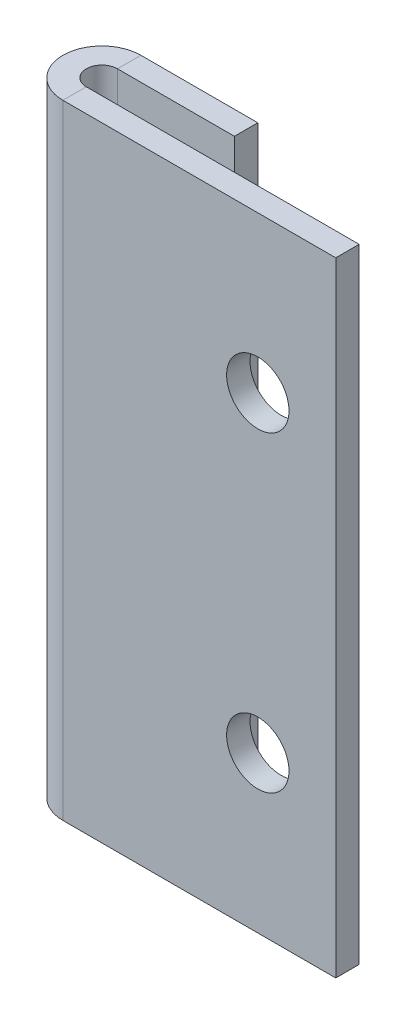
ISO-10303-21;
HEADER;
FILE_DESCRIPTION(('STEP AP214'),'2;1');
FILE_NAME('part.step','',(''),(''),'','','');
FILE_SCHEMA(('AUTOMOTIVE_DESIGN { 1 0 10303 214 1 1 1 1 }'));
ENDSEC;
DATA;
#1=APPLICATION_CONTEXT('core data for automotive mechanical design processes');
#2=APPLICATION_PROTOCOL_DEFINITION('international standard','automotive_design',2000,#1);
#3=PRODUCT_CONTEXT('',#1,'mechanical');
#4=PRODUCT('Part','Part','',(#3));
#5=PRODUCT_RELATED_PRODUCT_CATEGORY('part','',(#4));
#6=PRODUCT_DEFINITION_FORMATION('','',#4);
#7=PRODUCT_DEFINITION_CONTEXT('part definition',#1,'design');
#8=PRODUCT_DEFINITION('design','',#6,#7);
#9=PRODUCT_DEFINITION_SHAPE('','',#8);
#10=(LENGTH_UNIT() NAMED_UNIT(*) SI_UNIT(.MILLI.,.METRE.));
#11=(NAMED_UNIT(*) PLANE_ANGLE_UNIT() SI_UNIT($,.RADIAN.));
#12=(NAMED_UNIT(*) SI_UNIT($,.STERADIAN.) SOLID_ANGLE_UNIT());
#13=UNCERTAINTY_MEASURE_WITH_UNIT(LENGTH_MEASURE(1.E-05),#10,'distance_accuracy_value','');
#14=(GEOMETRIC_REPRESENTATION_CONTEXT(3) GLOBAL_UNCERTAINTY_ASSIGNED_CONTEXT((#13)) GLOBAL_UNIT_ASSIGNED_CONTEXT((#10,
#11,#12)) REPRESENTATION_CONTEXT('',''));
#15=CARTESIAN_POINT('',(0.,0.,0.));
#16=DIRECTION('',(0.,0.,1.));
#17=DIRECTION('',(1.,0.,0.));
#18=AXIS2_PLACEMENT_3D('',#15,#16,#17);
#19=CARTESIAN_POINT('',(-9.99999999999999,20.,-1.5));
#20=DIRECTION('',(0.,1.,0.));
#21=DIRECTION('',(0.,0.,1.));
#22=AXIS2_PLACEMENT_3D('',#19,#20,#21);
#23=PLANE('',#22);
#24=DIRECTION('',(-1.,0.,0.));
#25=VECTOR('',#24,1.);
#26=CARTESIAN_POINT('',(-9.99999999999999,20.,-1.5));
#27=LINE('',#26,#25);
#28=CARTESIAN_POINT('',(10.,20.,-1.5));
#29=VERTEX_POINT('',#28);
#30=CARTESIAN_POINT('',(-7.49999999999999,20.,-1.5));
#31=VERTEX_POINT('',#30);
#32=EDGE_CURVE('E191',#29,#31,#27,.T.);
#33=ORIENTED_EDGE('',*,*,#32,.T.);
#34=DIRECTION('',(0.,0.,1.));
#35=VECTOR('',#34,1.);
#36=CARTESIAN_POINT('',(-7.49999999999999,20.,-1.5));
#37=LINE('',#36,#35);
#38=CARTESIAN_POINT('',(-7.49999999999999,20.,0.));
#39=VERTEX_POINT('',#38);
#40=EDGE_CURVE('E71',#31,#39,#37,.T.);
#41=ORIENTED_EDGE('',*,*,#40,.T.);
#42=DIRECTION('',(-1.,0.,0.));
#43=VECTOR('',#42,1.);
#44=CARTESIAN_POINT('',(-9.99999999999999,20.,0.));
#45=LINE('',#44,#43);
#46=CARTESIAN_POINT('',(10.,20.,0.));
#47=VERTEX_POINT('',#46);
#48=EDGE_CURVE('E112',#47,#39,#45,.T.);
#49=ORIENTED_EDGE('',*,*,#48,.F.);
#50=DIRECTION('',(0.,0.,1.));
#51=VECTOR('',#50,1.);
#52=CARTESIAN_POINT('',(10.,20.,-1.5));
#53=LINE('',#52,#51);
#54=EDGE_CURVE('E41',#29,#47,#53,.T.);
#55=ORIENTED_EDGE('',*,*,#54,.F.);
#56=EDGE_LOOP('',(#33,#41,#49,#55));
#57=FACE_BOUND('',#56,.T.);
#58=ADVANCED_FACE('F37',(#57),#23,.T.);
#59=CARTESIAN_POINT('',(10.,-20.,-1.5));
#60=DIRECTION('',(1.,0.,0.));
#61=DIRECTION('',(0.,0.,-1.));
#62=AXIS2_PLACEMENT_3D('',#59,#60,#61);
#63=PLANE('',#62);
#64=DIRECTION('',(0.,1.,0.));
#65=VECTOR('',#64,1.);
#66=CARTESIAN_POINT('',(10.,-20.,0.));
#67=LINE('',#66,#65);
#68=CARTESIAN_POINT('',(10.,-20.,0.));
#69=VERTEX_POINT('',#68);
#70=EDGE_CURVE('E187',#69,#47,#67,.T.);
#71=ORIENTED_EDGE('',*,*,#70,.F.);
#72=DIRECTION('',(0.,0.,1.));
#73=VECTOR('',#72,1.);
#74=CARTESIAN_POINT('',(10.,-20.,-1.5));
#75=LINE('',#74,#73);
#76=CARTESIAN_POINT('',(10.,-20.,-1.5));
#77=VERTEX_POINT('',#76);
#78=EDGE_CURVE('E11',#77,#69,#75,.T.);
#79=ORIENTED_EDGE('',*,*,#78,.F.);
#80=DIRECTION('',(0.,1.,0.));
#81=VECTOR('',#80,1.);
#82=CARTESIAN_POINT('',(10.,-20.,-1.5));
#83=LINE('',#82,#81);
#84=EDGE_CURVE('E111',#77,#29,#83,.T.);
#85=ORIENTED_EDGE('',*,*,#84,.T.);
#86=ORIENTED_EDGE('',*,*,#54,.T.);
#87=EDGE_LOOP('',(#71,#79,#85,#86));
#88=FACE_BOUND('',#87,.T.);
#89=ADVANCED_FACE('F39',(#88),#63,.T.);
#90=CARTESIAN_POINT('',(-9.99999999999999,-20.,-1.5));
#91=DIRECTION('',(0.,-1.,0.));
#92=DIRECTION('',(0.,0.,-1.));
#93=AXIS2_PLACEMENT_3D('',#90,#91,#92);
#94=PLANE('',#93);
#95=DIRECTION('',(0.,0.,1.));
#96=VECTOR('',#95,1.);
#97=CARTESIAN_POINT('',(-7.49999999999999,-20.,-1.5));
#98=LINE('',#97,#96);
#99=CARTESIAN_POINT('',(-7.49999999999999,-20.,-1.5));
#100=VERTEX_POINT('',#99);
#101=CARTESIAN_POINT('',(-7.49999999999999,-20.,0.));
#102=VERTEX_POINT('',#101);
#103=EDGE_CURVE('E108',#100,#102,#98,.T.);
#104=ORIENTED_EDGE('',*,*,#103,.F.);
#105=DIRECTION('',(1.,0.,0.));
#106=VECTOR('',#105,1.);
#107=CARTESIAN_POINT('',(-9.99999999999999,-20.,-1.5));
#108=LINE('',#107,#106);
#109=EDGE_CURVE('E53',#100,#77,#108,.T.);
#110=ORIENTED_EDGE('',*,*,#109,.T.);
#111=ORIENTED_EDGE('',*,*,#78,.T.);
#112=DIRECTION('',(1.,0.,0.));
#113=VECTOR('',#112,1.);
#114=CARTESIAN_POINT('',(-9.99999999999999,-20.,0.));
#115=LINE('',#114,#113);
#116=EDGE_CURVE('E104',#102,#69,#115,.T.);
#117=ORIENTED_EDGE('',*,*,#116,.F.);
#118=EDGE_LOOP('',(#104,#110,#111,#117));
#119=FACE_BOUND('',#118,.T.);
#120=ADVANCED_FACE('F106',(#119),#94,.T.);
#121=CARTESIAN_POINT('',(0.,0.,-1.5));
#122=DIRECTION('',(0.,0.,-1.));
#123=DIRECTION('',(-1.,0.,0.));
#124=AXIS2_PLACEMENT_3D('',#121,#122,#123);
#125=PLANE('',#124);
#126=DIRECTION('',(0.,1.,0.));
#127=VECTOR('',#126,1.);
#128=CARTESIAN_POINT('',(-7.49999999999999,20.,-1.5));
#129=LINE('',#128,#127);
#130=EDGE_CURVE('E141',#31,#100,#129,.F.);
#131=ORIENTED_EDGE('',*,*,#130,.F.);
#132=ORIENTED_EDGE('',*,*,#32,.F.);
#133=ORIENTED_EDGE('',*,*,#84,.F.);
#134=ORIENTED_EDGE('',*,*,#109,.F.);
#135=EDGE_LOOP('',(#131,#132,#133,#134));
#136=FACE_BOUND('',#135,.T.);
#137=CARTESIAN_POINT('',(5.,-9.99999999999999,-1.5));
#138=DIRECTION('',(0.,0.,1.));
#139=DIRECTION('',(1.,0.,0.));
#140=AXIS2_PLACEMENT_3D('',#137,#138,#139);
#141=CIRCLE('',#140,2.);
#142=CARTESIAN_POINT('',(7.,-9.99999999999999,-1.5));
#143=VERTEX_POINT('',#142);
#144=EDGE_CURVE('E178',#143,#143,#141,.T.);
#145=ORIENTED_EDGE('',*,*,#144,.T.);
#146=EDGE_LOOP('',(#145));
#147=FACE_BOUND('',#146,.T.);
#148=CARTESIAN_POINT('',(5.,9.99999999999999,-1.5));
#149=DIRECTION('',(0.,0.,1.));
#150=DIRECTION('',(1.,0.,0.));
#151=AXIS2_PLACEMENT_3D('',#148,#149,#150);
#152=CIRCLE('',#151,2.);
#153=CARTESIAN_POINT('',(7.,9.99999999999999,-1.5));
#154=VERTEX_POINT('',#153);
#155=EDGE_CURVE('E184',#154,#154,#152,.T.);
#156=ORIENTED_EDGE('',*,*,#155,.T.);
#157=EDGE_LOOP('',(#156));
#158=FACE_BOUND('',#157,.T.);
#159=ADVANCED_FACE('F198',(#136,#147,#158),#125,.T.);
#160=CARTESIAN_POINT('',(0.,0.,0.));
#161=DIRECTION('',(0.,0.,-1.));
#162=DIRECTION('',(-1.,0.,0.));
#163=AXIS2_PLACEMENT_3D('',#160,#161,#162);
#164=PLANE('',#163);
#165=CARTESIAN_POINT('',(5.,-9.99999999999999,0.));
#166=DIRECTION('',(0.,0.,1.));
#167=DIRECTION('',(1.,0.,0.));
#168=AXIS2_PLACEMENT_3D('',#165,#166,#167);
#169=CIRCLE('',#168,2.);
#170=CARTESIAN_POINT('',(7.,-9.99999999999999,0.));
#171=VERTEX_POINT('',#170);
#172=EDGE_CURVE('E176',#171,#171,#169,.T.);
#173=ORIENTED_EDGE('',*,*,#172,.F.);
#174=EDGE_LOOP('',(#173));
#175=FACE_BOUND('',#174,.T.);
#176=CARTESIAN_POINT('',(5.,9.99999999999999,0.));
#177=DIRECTION('',(0.,0.,1.));
#178=DIRECTION('',(1.,0.,0.));
#179=AXIS2_PLACEMENT_3D('',#176,#177,#178);
#180=CIRCLE('',#179,2.);
#181=CARTESIAN_POINT('',(7.,9.99999999999999,0.));
#182=VERTEX_POINT('',#181);
#183=EDGE_CURVE('E181',#182,#182,#180,.T.);
#184=ORIENTED_EDGE('',*,*,#183,.F.);
#185=EDGE_LOOP('',(#184));
#186=FACE_BOUND('',#185,.T.);
#187=ORIENTED_EDGE('',*,*,#48,.T.);
#188=DIRECTION('',(0.,1.,0.));
#189=VECTOR('',#188,1.);
#190=CARTESIAN_POINT('',(-7.49999999999999,20.,0.));
#191=LINE('',#190,#189);
#192=EDGE_CURVE('E115',#39,#102,#191,.F.);
#193=ORIENTED_EDGE('',*,*,#192,.T.);
#194=ORIENTED_EDGE('',*,*,#116,.T.);
#195=ORIENTED_EDGE('',*,*,#70,.T.);
#196=EDGE_LOOP('',(#187,#193,#194,#195));
#197=FACE_BOUND('',#196,.T.);
#198=ADVANCED_FACE('F116',(#175,#186,#197),#164,.F.);
#199=CARTESIAN_POINT('',(5.,9.99999999999999,-1.5));
#200=DIRECTION('',(0.,0.,1.));
#201=DIRECTION('',(1.,0.,0.));
#202=AXIS2_PLACEMENT_3D('',#199,#200,#201);
#203=CYLINDRICAL_SURFACE('',#202,2.);
#204=ORIENTED_EDGE('',*,*,#155,.F.);
#205=EDGE_LOOP('',(#204));
#206=FACE_BOUND('',#205,.T.);
#207=ORIENTED_EDGE('',*,*,#183,.T.);
#208=EDGE_LOOP('',(#207));
#209=FACE_BOUND('',#208,.T.);
#210=ADVANCED_FACE('F239',(#206,#209),#203,.F.);
#211=CARTESIAN_POINT('',(5.,-9.99999999999999,-1.5));
#212=DIRECTION('',(0.,0.,1.));
#213=DIRECTION('',(1.,0.,0.));
#214=AXIS2_PLACEMENT_3D('',#211,#212,#213);
#215=CYLINDRICAL_SURFACE('',#214,2.);
#216=ORIENTED_EDGE('',*,*,#144,.F.);
#217=EDGE_LOOP('',(#216));
#218=FACE_BOUND('',#217,.T.);
#219=ORIENTED_EDGE('',*,*,#172,.T.);
#220=EDGE_LOOP('',(#219));
#221=FACE_BOUND('',#220,.T.);
#222=ADVANCED_FACE('F245',(#218,#221),#215,.F.);
#223=CARTESIAN_POINT('',(-3.74999999999999,20.,-5.));
#224=DIRECTION('',(0.,-1.,0.));
#225=DIRECTION('',(-1.,0.,0.));
#226=AXIS2_PLACEMENT_3D('',#223,#224,#225);
#227=PLANE('',#226);
#228=DIRECTION('',(0.,0.,-1.));
#229=VECTOR('',#228,1.);
#230=CARTESIAN_POINT('',(-7.49999999999999,20.,-5.));
#231=LINE('',#230,#229);
#232=CARTESIAN_POINT('',(-7.49999999999999,20.,-3.5));
#233=VERTEX_POINT('',#232);
#234=CARTESIAN_POINT('',(-7.49999999999999,20.,-5.));
#235=VERTEX_POINT('',#234);
#236=EDGE_CURVE('E170',#233,#235,#231,.T.);
#237=ORIENTED_EDGE('',*,*,#236,.F.);
#238=DIRECTION('',(-1.,0.,0.));
#239=VECTOR('',#238,1.);
#240=CARTESIAN_POINT('',(-3.74999999999999,20.,-3.5));
#241=LINE('',#240,#239);
#242=CARTESIAN_POINT('',(0.,20.,-3.5));
#243=VERTEX_POINT('',#242);
#244=EDGE_CURVE('E161',#243,#233,#241,.T.);
#245=ORIENTED_EDGE('',*,*,#244,.F.);
#246=DIRECTION('',(0.,0.,-1.));
#247=VECTOR('',#246,1.);
#248=CARTESIAN_POINT('',(0.,20.,-5.));
#249=LINE('',#248,#247);
#250=CARTESIAN_POINT('',(0.,20.,-5.));
#251=VERTEX_POINT('',#250);
#252=EDGE_CURVE('E168',#243,#251,#249,.T.);
#253=ORIENTED_EDGE('',*,*,#252,.T.);
#254=DIRECTION('',(-1.,0.,0.));
#255=VECTOR('',#254,1.);
#256=CARTESIAN_POINT('',(-3.74999999999999,20.,-5.));
#257=LINE('',#256,#255);
#258=EDGE_CURVE('E151',#251,#235,#257,.T.);
#259=ORIENTED_EDGE('',*,*,#258,.T.);
#260=EDGE_LOOP('',(#237,#245,#253,#259));
#261=FACE_BOUND('',#260,.T.);
#262=ADVANCED_FACE('F218',(#261),#227,.F.);
#263=CARTESIAN_POINT('',(0.,0.,-5.));
#264=DIRECTION('',(-1.,0.,0.));
#265=DIRECTION('',(0.,1.,0.));
#266=AXIS2_PLACEMENT_3D('',#263,#264,#265);
#267=PLANE('',#266);
#268=ORIENTED_EDGE('',*,*,#252,.F.);
#269=DIRECTION('',(0.,1.,0.));
#270=VECTOR('',#269,1.);
#271=CARTESIAN_POINT('',(0.,0.,-3.5));
#272=LINE('',#271,#270);
#273=CARTESIAN_POINT('',(0.,-20.,-3.5));
#274=VERTEX_POINT('',#273);
#275=EDGE_CURVE('E158',#274,#243,#272,.T.);
#276=ORIENTED_EDGE('',*,*,#275,.F.);
#277=DIRECTION('',(0.,0.,-1.));
#278=VECTOR('',#277,1.);
#279=CARTESIAN_POINT('',(0.,-20.,-5.));
#280=LINE('',#279,#278);
#281=CARTESIAN_POINT('',(0.,-20.,-5.));
#282=VERTEX_POINT('',#281);
#283=EDGE_CURVE('E150',#274,#282,#280,.T.);
#284=ORIENTED_EDGE('',*,*,#283,.T.);
#285=DIRECTION('',(0.,1.,0.));
#286=VECTOR('',#285,1.);
#287=CARTESIAN_POINT('',(0.,0.,-5.));
#288=LINE('',#287,#286);
#289=EDGE_CURVE('E147',#282,#251,#288,.T.);
#290=ORIENTED_EDGE('',*,*,#289,.T.);
#291=EDGE_LOOP('',(#268,#276,#284,#290));
#292=FACE_BOUND('',#291,.T.);
#293=ADVANCED_FACE('F215',(#292),#267,.F.);
#294=CARTESIAN_POINT('',(-3.74999999999999,-20.,-5.));
#295=DIRECTION('',(0.,1.,0.));
#296=DIRECTION('',(1.,0.,0.));
#297=AXIS2_PLACEMENT_3D('',#294,#295,#296);
#298=PLANE('',#297);
#299=DIRECTION('',(-1.,0.,0.));
#300=VECTOR('',#299,1.);
#301=CARTESIAN_POINT('',(-3.74999999999999,-20.,-3.5));
#302=LINE('',#301,#300);
#303=CARTESIAN_POINT('',(-7.49999999999999,-20.,-3.5));
#304=VERTEX_POINT('',#303);
#305=EDGE_CURVE('E131',#304,#274,#302,.F.);
#306=ORIENTED_EDGE('',*,*,#305,.F.);
#307=DIRECTION('',(0.,0.,-1.));
#308=VECTOR('',#307,1.);
#309=CARTESIAN_POINT('',(-7.49999999999999,-20.,-5.));
#310=LINE('',#309,#308);
#311=CARTESIAN_POINT('',(-7.49999999999999,-20.,-5.));
#312=VERTEX_POINT('',#311);
#313=EDGE_CURVE('E173',#304,#312,#310,.T.);
#314=ORIENTED_EDGE('',*,*,#313,.T.);
#315=DIRECTION('',(1.,0.,0.));
#316=VECTOR('',#315,1.);
#317=CARTESIAN_POINT('',(-3.74999999999999,-20.,-5.));
#318=LINE('',#317,#316);
#319=EDGE_CURVE('E155',#312,#282,#318,.T.);
#320=ORIENTED_EDGE('',*,*,#319,.T.);
#321=ORIENTED_EDGE('',*,*,#283,.F.);
#322=EDGE_LOOP('',(#306,#314,#320,#321));
#323=FACE_BOUND('',#322,.T.);
#324=ADVANCED_FACE('F212',(#323),#298,.F.);
#325=CARTESIAN_POINT('',(-3.74999999999999,0.,-5.));
#326=DIRECTION('',(0.,0.,-1.));
#327=DIRECTION('',(-1.,0.,0.));
#328=AXIS2_PLACEMENT_3D('',#325,#326,#327);
#329=PLANE('',#328);
#330=ORIENTED_EDGE('',*,*,#289,.F.);
#331=ORIENTED_EDGE('',*,*,#319,.F.);
#332=DIRECTION('',(0.,-1.,0.));
#333=VECTOR('',#332,1.);
#334=CARTESIAN_POINT('',(-7.49999999999999,0.,-5.));
#335=LINE('',#334,#333);
#336=EDGE_CURVE('E135',#235,#312,#335,.T.);
#337=ORIENTED_EDGE('',*,*,#336,.F.);
#338=ORIENTED_EDGE('',*,*,#258,.F.);
#339=EDGE_LOOP('',(#330,#331,#337,#338));
#340=FACE_BOUND('',#339,.T.);
#341=ADVANCED_FACE('F220',(#340),#329,.T.);
#342=CARTESIAN_POINT('',(-3.74999999999999,0.,-3.5));
#343=DIRECTION('',(0.,0.,-1.));
#344=DIRECTION('',(-1.,0.,0.));
#345=AXIS2_PLACEMENT_3D('',#342,#343,#344);
#346=PLANE('',#345);
#347=ORIENTED_EDGE('',*,*,#275,.T.);
#348=ORIENTED_EDGE('',*,*,#244,.T.);
#349=DIRECTION('',(0.,1.,0.));
#350=VECTOR('',#349,1.);
#351=CARTESIAN_POINT('',(-7.49999999999999,0.,-3.5));
#352=LINE('',#351,#350);
#353=EDGE_CURVE('E164',#233,#304,#352,.F.);
#354=ORIENTED_EDGE('',*,*,#353,.T.);
#355=ORIENTED_EDGE('',*,*,#305,.T.);
#356=EDGE_LOOP('',(#347,#348,#354,#355));
#357=FACE_BOUND('',#356,.T.);
#358=ADVANCED_FACE('F208',(#357),#346,.F.);
#359=CARTESIAN_POINT('',(-7.49999999999999,-20.,-2.5));
#360=DIRECTION('',(0.,-1.,0.));
#361=DIRECTION('',(0.,0.,-1.));
#362=AXIS2_PLACEMENT_3D('',#359,#360,#361);
#363=PLANE('',#362);
#364=ORIENTED_EDGE('',*,*,#313,.F.);
#365=CARTESIAN_POINT('',(-7.49999999999999,-20.,-2.5));
#366=DIRECTION('',(0.,1.,0.));
#367=DIRECTION('',(0.,0.,1.));
#368=AXIS2_PLACEMENT_3D('',#365,#366,#367);
#369=CIRCLE('',#368,1.);
#370=EDGE_CURVE('E130',#100,#304,#369,.F.);
#371=ORIENTED_EDGE('',*,*,#370,.F.);
#372=ORIENTED_EDGE('',*,*,#103,.T.);
#373=CARTESIAN_POINT('',(-7.49999999999999,-20.,-2.5));
#374=DIRECTION('',(0.,1.,0.));
#375=DIRECTION('',(0.,0.,1.));
#376=AXIS2_PLACEMENT_3D('',#373,#374,#375);
#377=CIRCLE('',#376,2.5);
#378=EDGE_CURVE('E121',#102,#312,#377,.F.);
#379=ORIENTED_EDGE('',*,*,#378,.T.);
#380=EDGE_LOOP('',(#364,#371,#372,#379));
#381=FACE_BOUND('',#380,.T.);
#382=ADVANCED_FACE('F128',(#381),#363,.T.);
#383=CARTESIAN_POINT('',(-7.49999999999999,20.,-2.5));
#384=DIRECTION('',(0.,-1.,0.));
#385=DIRECTION('',(0.,0.,-1.));
#386=AXIS2_PLACEMENT_3D('',#383,#384,#385);
#387=PLANE('',#386);
#388=CARTESIAN_POINT('',(-7.49999999999999,20.,-2.5));
#389=DIRECTION('',(0.,1.,0.));
#390=DIRECTION('',(0.,0.,1.));
#391=AXIS2_PLACEMENT_3D('',#388,#389,#390);
#392=CIRCLE('',#391,1.);
#393=EDGE_CURVE('E144',#233,#31,#392,.T.);
#394=ORIENTED_EDGE('',*,*,#393,.F.);
#395=ORIENTED_EDGE('',*,*,#236,.T.);
#396=CARTESIAN_POINT('',(-7.49999999999999,20.,-2.5));
#397=DIRECTION('',(0.,1.,0.));
#398=DIRECTION('',(0.,0.,1.));
#399=AXIS2_PLACEMENT_3D('',#396,#397,#398);
#400=CIRCLE('',#399,2.5);
#401=EDGE_CURVE('E122',#235,#39,#400,.T.);
#402=ORIENTED_EDGE('',*,*,#401,.T.);
#403=ORIENTED_EDGE('',*,*,#40,.F.);
#404=EDGE_LOOP('',(#394,#395,#402,#403));
#405=FACE_BOUND('',#404,.T.);
#406=ADVANCED_FACE('F202',(#405),#387,.F.);
#407=CARTESIAN_POINT('',(-7.49999999999999,20.,-2.5));
#408=DIRECTION('',(0.,1.,0.));
#409=DIRECTION('',(0.,0.,-1.));
#410=AXIS2_PLACEMENT_3D('',#407,#408,#409);
#411=CYLINDRICAL_SURFACE('',#410,2.5);
#412=ORIENTED_EDGE('',*,*,#192,.F.);
#413=ORIENTED_EDGE('',*,*,#401,.F.);
#414=ORIENTED_EDGE('',*,*,#336,.T.);
#415=ORIENTED_EDGE('',*,*,#378,.F.);
#416=EDGE_LOOP('',(#412,#413,#414,#415));
#417=FACE_BOUND('',#416,.T.);
#418=ADVANCED_FACE('F134',(#417),#411,.T.);
#419=CARTESIAN_POINT('',(-7.49999999999999,20.,-2.5));
#420=DIRECTION('',(0.,1.,0.));
#421=DIRECTION('',(0.,0.,-1.));
#422=AXIS2_PLACEMENT_3D('',#419,#420,#421);
#423=CYLINDRICAL_SURFACE('',#422,1.);
#424=ORIENTED_EDGE('',*,*,#130,.T.);
#425=ORIENTED_EDGE('',*,*,#370,.T.);
#426=ORIENTED_EDGE('',*,*,#353,.F.);
#427=ORIENTED_EDGE('',*,*,#393,.T.);
#428=EDGE_LOOP('',(#424,#425,#426,#427));
#429=FACE_BOUND('',#428,.T.);
#430=ADVANCED_FACE('F205',(#429),#423,.F.);
#431=CLOSED_SHELL('',(#58,#89,#120,#159,#198,#210,#222,#262,#293,#324,#341,#358,#382,#406,#418,#430));
#432=MANIFOLD_SOLID_BREP('B2',#431);
#433=ADVANCED_BREP_SHAPE_REPRESENTATION('',(#18,#432),#14);
#434=SHAPE_DEFINITION_REPRESENTATION(#9,#433);
ENDSEC;
END-ISO-10303-21;
